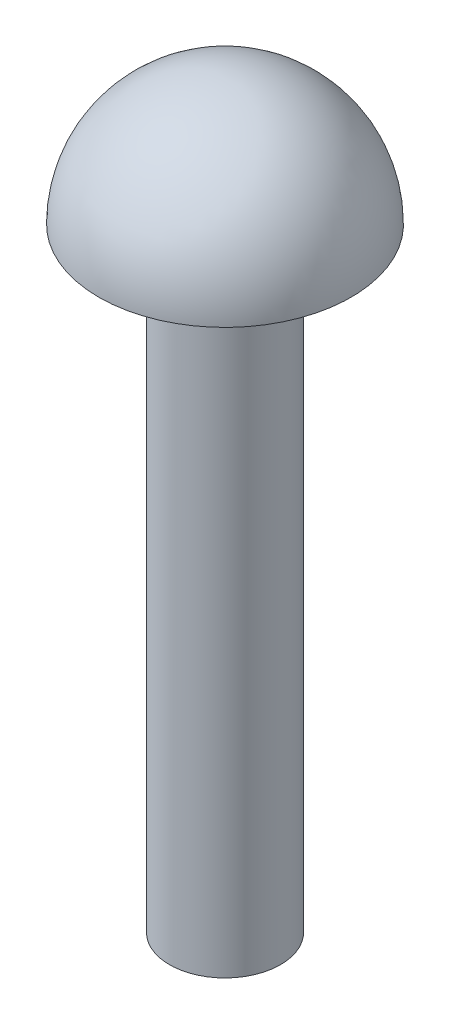
ISO-10303-21;
HEADER;
FILE_DESCRIPTION(('STEP AP214'),'2;1');
FILE_NAME('part.step','',(''),(''),'','','');
FILE_SCHEMA(('AUTOMOTIVE_DESIGN { 1 0 10303 214 1 1 1 1 }'));
ENDSEC;
DATA;
#1=APPLICATION_CONTEXT('core data for automotive mechanical design processes');
#2=APPLICATION_PROTOCOL_DEFINITION('international standard','automotive_design',2000,#1);
#3=PRODUCT_CONTEXT('',#1,'mechanical');
#4=PRODUCT('Part','Part','',(#3));
#5=PRODUCT_RELATED_PRODUCT_CATEGORY('part','',(#4));
#6=PRODUCT_DEFINITION_FORMATION('','',#4);
#7=PRODUCT_DEFINITION_CONTEXT('part definition',#1,'design');
#8=PRODUCT_DEFINITION('design','',#6,#7);
#9=PRODUCT_DEFINITION_SHAPE('','',#8);
#10=(LENGTH_UNIT() NAMED_UNIT(*) SI_UNIT(.MILLI.,.METRE.));
#11=(NAMED_UNIT(*) PLANE_ANGLE_UNIT() SI_UNIT($,.RADIAN.));
#12=(NAMED_UNIT(*) SI_UNIT($,.STERADIAN.) SOLID_ANGLE_UNIT());
#13=UNCERTAINTY_MEASURE_WITH_UNIT(LENGTH_MEASURE(1.E-05),#10,'distance_accuracy_value','');
#14=(GEOMETRIC_REPRESENTATION_CONTEXT(3) GLOBAL_UNCERTAINTY_ASSIGNED_CONTEXT((#13)) GLOBAL_UNIT_ASSIGNED_CONTEXT((#10,
#11,#12)) REPRESENTATION_CONTEXT('',''));
#15=CARTESIAN_POINT('',(0.,0.,0.));
#16=DIRECTION('',(0.,0.,1.));
#17=DIRECTION('',(1.,0.,0.));
#18=AXIS2_PLACEMENT_3D('',#15,#16,#17);
#19=CARTESIAN_POINT('',(0.,183.,0.));
#20=DIRECTION('',(0.,-1.,0.));
#21=DIRECTION('',(0.,0.,-1.));
#22=AXIS2_PLACEMENT_3D('',#19,#20,#21);
#23=CYLINDRICAL_SURFACE('',#22,11.);
#24=CARTESIAN_POINT('',(0.,183.,0.));
#25=DIRECTION('',(0.,1.,0.));
#26=DIRECTION('',(0.,0.,1.));
#27=AXIS2_PLACEMENT_3D('',#24,#25,#26);
#28=CIRCLE('',#27,11.);
#29=CARTESIAN_POINT('',(0.,183.,11.));
#30=VERTEX_POINT('',#29);
#31=EDGE_CURVE('E10',#30,#30,#28,.T.);
#32=ORIENTED_EDGE('',*,*,#31,.F.);
#33=EDGE_LOOP('',(#32));
#34=FACE_BOUND('',#33,.T.);
#35=CARTESIAN_POINT('',(0.,61.5,0.));
#36=DIRECTION('',(0.,-1.,0.));
#37=DIRECTION('',(0.,0.,-1.));
#38=AXIS2_PLACEMENT_3D('',#35,#36,#37);
#39=CIRCLE('',#38,11.);
#40=CARTESIAN_POINT('',(0.,61.5,-11.));
#41=VERTEX_POINT('',#40);
#42=EDGE_CURVE('E42',#41,#41,#39,.T.);
#43=ORIENTED_EDGE('',*,*,#42,.F.);
#44=EDGE_LOOP('',(#43));
#45=FACE_BOUND('',#44,.T.);
#46=ADVANCED_FACE('F38',(#34,#45),#23,.T.);
#47=CARTESIAN_POINT('',(0.,183.,0.));
#48=DIRECTION('',(0.,1.,0.));
#49=DIRECTION('',(0.,0.,1.));
#50=AXIS2_PLACEMENT_3D('',#47,#48,#49);
#51=PLANE('',#50);
#52=ORIENTED_EDGE('',*,*,#31,.T.);
#53=EDGE_LOOP('',(#52));
#54=FACE_BOUND('',#53,.T.);
#55=CARTESIAN_POINT('',(0.,183.,0.));
#56=DIRECTION('',(0.,1.,0.));
#57=DIRECTION('',(0.,0.,1.));
#58=AXIS2_PLACEMENT_3D('',#55,#56,#57);
#59=CIRCLE('',#58,25.);
#60=CARTESIAN_POINT('',(0.,183.,25.));
#61=VERTEX_POINT('',#60);
#62=EDGE_CURVE('E46',#61,#61,#59,.T.);
#63=ORIENTED_EDGE('',*,*,#62,.F.);
#64=EDGE_LOOP('',(#63));
#65=FACE_BOUND('',#64,.T.);
#66=ADVANCED_FACE('F65',(#54,#65),#51,.F.);
#67=CARTESIAN_POINT('',(0.,183.,0.));
#68=DIRECTION('',(0.,1.,0.));
#69=DIRECTION('',(0.,0.,1.));
#70=AXIS2_PLACEMENT_3D('',#67,#68,#69);
#71=SPHERICAL_SURFACE('',#70,25.);
#72=ORIENTED_EDGE('',*,*,#62,.T.);
#73=EDGE_LOOP('',(#72));
#74=FACE_BOUND('',#73,.T.);
#75=ADVANCED_FACE('F40',(#74),#71,.T.);
#76=CARTESIAN_POINT('',(0.,61.5,0.));
#77=DIRECTION('',(0.,-1.,0.));
#78=DIRECTION('',(0.,0.,-1.));
#79=AXIS2_PLACEMENT_3D('',#76,#77,#78);
#80=PLANE('',#79);
#81=CARTESIAN_POINT('',(0.,61.5,0.));
#82=DIRECTION('',(0.,-1.,0.));
#83=DIRECTION('',(0.,0.,-1.));
#84=AXIS2_PLACEMENT_3D('',#81,#82,#83);
#85=CIRCLE('',#84,7.5);
#86=CARTESIAN_POINT('',(0.,61.5,-7.5));
#87=VERTEX_POINT('',#86);
#88=EDGE_CURVE('E52',#87,#87,#85,.T.);
#89=ORIENTED_EDGE('',*,*,#88,.F.);
#90=EDGE_LOOP('',(#89));
#91=FACE_BOUND('',#90,.T.);
#92=ORIENTED_EDGE('',*,*,#42,.T.);
#93=EDGE_LOOP('',(#92));
#94=FACE_BOUND('',#93,.T.);
#95=ADVANCED_FACE('F62',(#91,#94),#80,.T.);
#96=CARTESIAN_POINT('',(0.,91.5,0.));
#97=DIRECTION('',(0.,-1.,0.));
#98=DIRECTION('',(0.,0.,-1.));
#99=AXIS2_PLACEMENT_3D('',#96,#97,#98);
#100=CYLINDRICAL_SURFACE('',#99,7.5);
#101=CARTESIAN_POINT('',(0.,91.5,0.));
#102=DIRECTION('',(0.,-1.,0.));
#103=DIRECTION('',(0.,0.,-1.));
#104=AXIS2_PLACEMENT_3D('',#101,#102,#103);
#105=CIRCLE('',#104,7.5);
#106=CARTESIAN_POINT('',(0.,91.5,-7.5));
#107=VERTEX_POINT('',#106);
#108=EDGE_CURVE('E55',#107,#107,#105,.T.);
#109=ORIENTED_EDGE('',*,*,#108,.F.);
#110=EDGE_LOOP('',(#109));
#111=FACE_BOUND('',#110,.T.);
#112=ORIENTED_EDGE('',*,*,#88,.T.);
#113=EDGE_LOOP('',(#112));
#114=FACE_BOUND('',#113,.T.);
#115=ADVANCED_FACE('F75',(#111,#114),#100,.F.);
#116=CARTESIAN_POINT('',(0.,91.5,0.));
#117=DIRECTION('',(0.,-1.,0.));
#118=DIRECTION('',(0.,0.,-1.));
#119=AXIS2_PLACEMENT_3D('',#116,#117,#118);
#120=PLANE('',#119);
#121=ORIENTED_EDGE('',*,*,#108,.T.);
#122=EDGE_LOOP('',(#121));
#123=FACE_BOUND('',#122,.T.);
#124=ADVANCED_FACE('F79',(#123),#120,.T.);
#125=CLOSED_SHELL('',(#46,#66,#75,#95,#115,#124));
#126=MANIFOLD_SOLID_BREP('B2',#125);
#127=ADVANCED_BREP_SHAPE_REPRESENTATION('',(#18,#126),#14);
#128=SHAPE_DEFINITION_REPRESENTATION(#9,#127);
ENDSEC;
END-ISO-10303-21;
